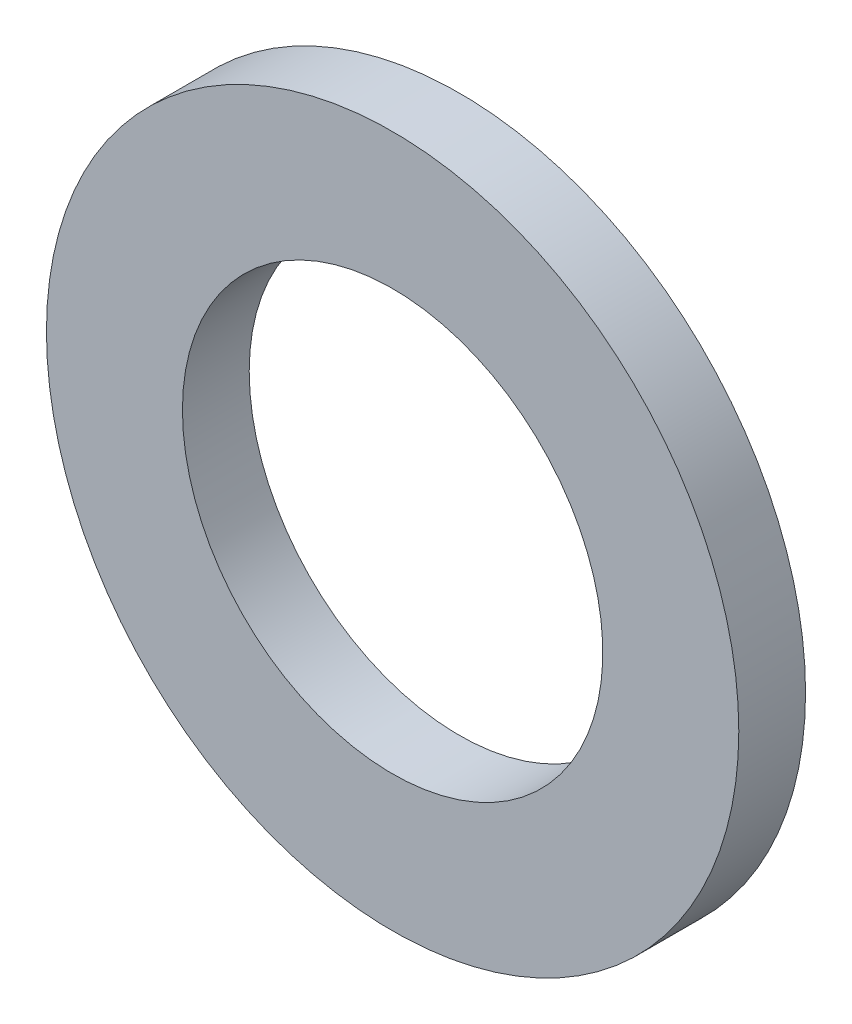
ISO-10303-21;
HEADER;
FILE_DESCRIPTION(('STEP AP214'),'2;1');
FILE_NAME('part.step','',(''),(''),'','','');
FILE_SCHEMA(('AUTOMOTIVE_DESIGN { 1 0 10303 214 1 1 1 1 }'));
ENDSEC;
DATA;
#1=APPLICATION_CONTEXT('core data for automotive mechanical design processes');
#2=APPLICATION_PROTOCOL_DEFINITION('international standard','automotive_design',2000,#1);
#3=PRODUCT_CONTEXT('',#1,'mechanical');
#4=PRODUCT('Part','Part','',(#3));
#5=PRODUCT_RELATED_PRODUCT_CATEGORY('part','',(#4));
#6=PRODUCT_DEFINITION_FORMATION('','',#4);
#7=PRODUCT_DEFINITION_CONTEXT('part definition',#1,'design');
#8=PRODUCT_DEFINITION('design','',#6,#7);
#9=PRODUCT_DEFINITION_SHAPE('','',#8);
#10=(LENGTH_UNIT() NAMED_UNIT(*) SI_UNIT(.MILLI.,.METRE.));
#11=(NAMED_UNIT(*) PLANE_ANGLE_UNIT() SI_UNIT($,.RADIAN.));
#12=(NAMED_UNIT(*) SI_UNIT($,.STERADIAN.) SOLID_ANGLE_UNIT());
#13=UNCERTAINTY_MEASURE_WITH_UNIT(LENGTH_MEASURE(1.E-05),#10,'distance_accuracy_value','');
#14=(GEOMETRIC_REPRESENTATION_CONTEXT(3) GLOBAL_UNCERTAINTY_ASSIGNED_CONTEXT((#13)) GLOBAL_UNIT_ASSIGNED_CONTEXT((#10,
#11,#12)) REPRESENTATION_CONTEXT('',''));
#15=CARTESIAN_POINT('',(0.,0.,0.));
#16=DIRECTION('',(0.,0.,1.));
#17=DIRECTION('',(1.,0.,0.));
#18=AXIS2_PLACEMENT_3D('',#15,#16,#17);
#19=CARTESIAN_POINT('',(0.,0.,2.7));
#20=DIRECTION('',(0.,0.,1.));
#21=DIRECTION('',(1.,0.,0.));
#22=AXIS2_PLACEMENT_3D('',#19,#20,#21);
#23=PLANE('',#22);
#24=CARTESIAN_POINT('',(0.,0.,2.7));
#25=DIRECTION('',(0.,0.,1.));
#26=DIRECTION('',(1.,0.,0.));
#27=AXIS2_PLACEMENT_3D('',#24,#25,#26);
#28=CIRCLE('',#27,14.);
#29=CARTESIAN_POINT('',(-14.,0.,2.7));
#30=VERTEX_POINT('',#29);
#31=EDGE_CURVE('E10',#30,#30,#28,.T.);
#32=ORIENTED_EDGE('',*,*,#31,.T.);
#33=EDGE_LOOP('',(#32));
#34=FACE_BOUND('',#33,.T.);
#35=CARTESIAN_POINT('',(0.,0.,2.7));
#36=DIRECTION('',(0.,0.,1.));
#37=DIRECTION('',(1.,0.,0.));
#38=AXIS2_PLACEMENT_3D('',#35,#36,#37);
#39=CIRCLE('',#38,8.5);
#40=CARTESIAN_POINT('',(-8.5,0.,2.7));
#41=VERTEX_POINT('',#40);
#42=EDGE_CURVE('E43',#41,#41,#39,.T.);
#43=ORIENTED_EDGE('',*,*,#42,.F.);
#44=EDGE_LOOP('',(#43));
#45=FACE_BOUND('',#44,.T.);
#46=ADVANCED_FACE('F32',(#34,#45),#23,.T.);
#47=CARTESIAN_POINT('',(0.,0.,0.));
#48=DIRECTION('',(0.,0.,1.));
#49=DIRECTION('',(1.,0.,0.));
#50=AXIS2_PLACEMENT_3D('',#47,#48,#49);
#51=PLANE('',#50);
#52=CARTESIAN_POINT('',(0.,0.,0.));
#53=DIRECTION('',(0.,0.,1.));
#54=DIRECTION('',(1.,0.,0.));
#55=AXIS2_PLACEMENT_3D('',#52,#53,#54);
#56=CIRCLE('',#55,14.);
#57=CARTESIAN_POINT('',(-14.,0.,0.));
#58=VERTEX_POINT('',#57);
#59=EDGE_CURVE('E36',#58,#58,#56,.T.);
#60=ORIENTED_EDGE('',*,*,#59,.F.);
#61=EDGE_LOOP('',(#60));
#62=FACE_BOUND('',#61,.T.);
#63=CARTESIAN_POINT('',(0.,0.,0.));
#64=DIRECTION('',(0.,0.,1.));
#65=DIRECTION('',(1.,0.,0.));
#66=AXIS2_PLACEMENT_3D('',#63,#64,#65);
#67=CIRCLE('',#66,8.5);
#68=CARTESIAN_POINT('',(-8.5,0.,0.));
#69=VERTEX_POINT('',#68);
#70=EDGE_CURVE('E45',#69,#69,#67,.T.);
#71=ORIENTED_EDGE('',*,*,#70,.T.);
#72=EDGE_LOOP('',(#71));
#73=FACE_BOUND('',#72,.T.);
#74=ADVANCED_FACE('F55',(#62,#73),#51,.F.);
#75=CARTESIAN_POINT('',(0.,0.,2.7));
#76=DIRECTION('',(0.,0.,-1.));
#77=DIRECTION('',(-1.,0.,0.));
#78=AXIS2_PLACEMENT_3D('',#75,#76,#77);
#79=CYLINDRICAL_SURFACE('',#78,14.);
#80=CARTESIAN_POINT('',(-14.,0.,2.7));
#81=CARTESIAN_POINT('',(-14.,0.,2.671875));
#82=CARTESIAN_POINT('',(-14.,0.,2.64375));
#83=CARTESIAN_POINT('',(-14.,0.,2.5875));
#84=CARTESIAN_POINT('',(-14.,0.,2.559375));
#85=CARTESIAN_POINT('',(-14.,0.,2.503125));
#86=CARTESIAN_POINT('',(-14.,0.,2.475));
#87=CARTESIAN_POINT('',(-14.,0.,2.41875));
#88=CARTESIAN_POINT('',(-14.,0.,2.390625));
#89=CARTESIAN_POINT('',(-14.,0.,2.334375));
#90=CARTESIAN_POINT('',(-14.,0.,2.30625));
#91=CARTESIAN_POINT('',(-14.,0.,2.25));
#92=CARTESIAN_POINT('',(-14.,0.,2.221875));
#93=CARTESIAN_POINT('',(-14.,0.,2.165625));
#94=CARTESIAN_POINT('',(-14.,0.,2.1375));
#95=CARTESIAN_POINT('',(-14.,0.,2.08125));
#96=CARTESIAN_POINT('',(-14.,0.,2.053125));
#97=CARTESIAN_POINT('',(-14.,0.,1.996875));
#98=CARTESIAN_POINT('',(-14.,0.,1.96875));
#99=CARTESIAN_POINT('',(-14.,0.,1.9125));
#100=CARTESIAN_POINT('',(-14.,0.,1.884375));
#101=CARTESIAN_POINT('',(-14.,0.,1.828125));
#102=CARTESIAN_POINT('',(-14.,0.,1.8));
#103=CARTESIAN_POINT('',(-14.,0.,1.74375));
#104=CARTESIAN_POINT('',(-14.,0.,1.715625));
#105=CARTESIAN_POINT('',(-14.,0.,1.659375));
#106=CARTESIAN_POINT('',(-14.,0.,1.63125));
#107=CARTESIAN_POINT('',(-14.,0.,1.575));
#108=CARTESIAN_POINT('',(-14.,0.,1.546875));
#109=CARTESIAN_POINT('',(-14.,0.,1.490625));
#110=CARTESIAN_POINT('',(-14.,0.,1.4625));
#111=CARTESIAN_POINT('',(-14.,0.,1.40625));
#112=CARTESIAN_POINT('',(-14.,0.,1.378125));
#113=CARTESIAN_POINT('',(-14.,0.,1.321875));
#114=CARTESIAN_POINT('',(-14.,0.,1.29375));
#115=CARTESIAN_POINT('',(-14.,0.,1.2375));
#116=CARTESIAN_POINT('',(-14.,0.,1.209375));
#117=CARTESIAN_POINT('',(-14.,0.,1.153125));
#118=CARTESIAN_POINT('',(-14.,0.,1.125));
#119=CARTESIAN_POINT('',(-14.,0.,1.06875));
#120=CARTESIAN_POINT('',(-14.,0.,1.040625));
#121=CARTESIAN_POINT('',(-14.,0.,0.984375));
#122=CARTESIAN_POINT('',(-14.,0.,0.95625));
#123=CARTESIAN_POINT('',(-14.,0.,0.9));
#124=CARTESIAN_POINT('',(-14.,0.,0.871875));
#125=CARTESIAN_POINT('',(-14.,0.,0.815625));
#126=CARTESIAN_POINT('',(-14.,0.,0.7875));
#127=CARTESIAN_POINT('',(-14.,0.,0.73125));
#128=CARTESIAN_POINT('',(-14.,0.,0.703125));
#129=CARTESIAN_POINT('',(-14.,0.,0.646875));
#130=CARTESIAN_POINT('',(-14.,0.,0.61875));
#131=CARTESIAN_POINT('',(-14.,0.,0.5625));
#132=CARTESIAN_POINT('',(-14.,0.,0.534375));
#133=CARTESIAN_POINT('',(-14.,0.,0.478125));
#134=CARTESIAN_POINT('',(-14.,0.,0.45));
#135=CARTESIAN_POINT('',(-14.,0.,0.39375));
#136=CARTESIAN_POINT('',(-14.,0.,0.365625));
#137=CARTESIAN_POINT('',(-14.,0.,0.309375));
#138=CARTESIAN_POINT('',(-14.,0.,0.28125));
#139=CARTESIAN_POINT('',(-14.,0.,0.225));
#140=CARTESIAN_POINT('',(-14.,0.,0.196875));
#141=CARTESIAN_POINT('',(-14.,0.,0.140625));
#142=CARTESIAN_POINT('',(-14.,0.,0.112499999999999));
#143=CARTESIAN_POINT('',(-14.,0.,0.0562499999999994));
#144=CARTESIAN_POINT('',(-14.,0.,0.0281249999999995));
#145=CARTESIAN_POINT('',(-14.,0.,0.));
#146=B_SPLINE_CURVE_WITH_KNOTS('',3,(#80,#81,#82,#83,#84,#85,#86,#87,#88,#89,#90,#91,#92,#93,
#94,#95,#96,#97,#98,#99,#100,#101,#102,#103,#104,#105,#106,#107,#108,#109,#110,#111,#112,#113,
#114,#115,#116,#117,#118,#119,#120,#121,#122,#123,#124,#125,#126,#127,#128,#129,#130,#131,#132,
#133,#134,#135,#136,#137,#138,#139,#140,#141,#142,#143,#144,#145),.UNSPECIFIED.,.F.,.F.,(4,2,2,
2,2,2,2,2,2,2,2,2,2,2,2,2,2,2,2,2,2,2,2,2,2,2,2,2,2,2,2,2,4),(0.,0.0843749999999998,0.16875,
0.253125,0.3375,0.421875,0.50625,0.590625,0.675,0.759375,0.84375,0.928125,1.0125,1.096875,
1.18125,1.265625,1.35,1.434375,1.51875,1.603125,1.6875,1.771875,1.85625,1.940625,2.025,2.109375,
2.19375,2.278125,2.3625,2.446875,2.53125,2.615625,2.7),.UNSPECIFIED.);
#147=EDGE_CURVE('BSEAM34',#30,#58,#146,.T.);
#148=ORIENTED_EDGE('',*,*,#31,.F.);
#149=ORIENTED_EDGE('',*,*,#59,.T.);
#150=ORIENTED_EDGE('',*,*,#147,.T.);
#151=ORIENTED_EDGE('',*,*,#147,.F.);
#152=EDGE_LOOP('',(#148,#150,#149,#151));
#153=FACE_BOUND('',#152,.T.);
#154=ADVANCED_FACE('F34',(#153),#79,.T.);
#155=CARTESIAN_POINT('',(0.,0.,2.7));
#156=DIRECTION('',(0.,0.,-1.));
#157=DIRECTION('',(-1.,0.,0.));
#158=AXIS2_PLACEMENT_3D('',#155,#156,#157);
#159=CYLINDRICAL_SURFACE('',#158,8.5);
#160=CARTESIAN_POINT('',(-8.5,0.,2.7));
#161=CARTESIAN_POINT('',(-8.5,0.,2.671875));
#162=CARTESIAN_POINT('',(-8.5,0.,2.64375));
#163=CARTESIAN_POINT('',(-8.5,0.,2.5875));
#164=CARTESIAN_POINT('',(-8.5,0.,2.559375));
#165=CARTESIAN_POINT('',(-8.5,0.,2.503125));
#166=CARTESIAN_POINT('',(-8.5,0.,2.475));
#167=CARTESIAN_POINT('',(-8.5,0.,2.41875));
#168=CARTESIAN_POINT('',(-8.5,0.,2.390625));
#169=CARTESIAN_POINT('',(-8.5,0.,2.334375));
#170=CARTESIAN_POINT('',(-8.5,0.,2.30625));
#171=CARTESIAN_POINT('',(-8.5,0.,2.25));
#172=CARTESIAN_POINT('',(-8.5,0.,2.221875));
#173=CARTESIAN_POINT('',(-8.5,0.,2.165625));
#174=CARTESIAN_POINT('',(-8.5,0.,2.1375));
#175=CARTESIAN_POINT('',(-8.5,0.,2.08125));
#176=CARTESIAN_POINT('',(-8.5,0.,2.053125));
#177=CARTESIAN_POINT('',(-8.5,0.,1.996875));
#178=CARTESIAN_POINT('',(-8.5,0.,1.96875));
#179=CARTESIAN_POINT('',(-8.5,0.,1.9125));
#180=CARTESIAN_POINT('',(-8.5,0.,1.884375));
#181=CARTESIAN_POINT('',(-8.5,0.,1.828125));
#182=CARTESIAN_POINT('',(-8.5,0.,1.8));
#183=CARTESIAN_POINT('',(-8.5,0.,1.74375));
#184=CARTESIAN_POINT('',(-8.5,0.,1.715625));
#185=CARTESIAN_POINT('',(-8.5,0.,1.659375));
#186=CARTESIAN_POINT('',(-8.5,0.,1.63125));
#187=CARTESIAN_POINT('',(-8.5,0.,1.575));
#188=CARTESIAN_POINT('',(-8.5,0.,1.546875));
#189=CARTESIAN_POINT('',(-8.5,0.,1.490625));
#190=CARTESIAN_POINT('',(-8.5,0.,1.4625));
#191=CARTESIAN_POINT('',(-8.5,0.,1.40625));
#192=CARTESIAN_POINT('',(-8.5,0.,1.378125));
#193=CARTESIAN_POINT('',(-8.5,0.,1.321875));
#194=CARTESIAN_POINT('',(-8.5,0.,1.29375));
#195=CARTESIAN_POINT('',(-8.5,0.,1.2375));
#196=CARTESIAN_POINT('',(-8.5,0.,1.209375));
#197=CARTESIAN_POINT('',(-8.5,0.,1.153125));
#198=CARTESIAN_POINT('',(-8.5,0.,1.125));
#199=CARTESIAN_POINT('',(-8.5,0.,1.06875));
#200=CARTESIAN_POINT('',(-8.5,0.,1.040625));
#201=CARTESIAN_POINT('',(-8.5,0.,0.984375));
#202=CARTESIAN_POINT('',(-8.5,0.,0.956249999999999));
#203=CARTESIAN_POINT('',(-8.5,0.,0.899999999999999));
#204=CARTESIAN_POINT('',(-8.5,0.,0.871875));
#205=CARTESIAN_POINT('',(-8.5,0.,0.815624999999999));
#206=CARTESIAN_POINT('',(-8.5,0.,0.787499999999999));
#207=CARTESIAN_POINT('',(-8.5,0.,0.73125));
#208=CARTESIAN_POINT('',(-8.5,0.,0.703125));
#209=CARTESIAN_POINT('',(-8.5,0.,0.646875));
#210=CARTESIAN_POINT('',(-8.5,0.,0.61875));
#211=CARTESIAN_POINT('',(-8.5,0.,0.5625));
#212=CARTESIAN_POINT('',(-8.5,0.,0.534375));
#213=CARTESIAN_POINT('',(-8.5,0.,0.478125));
#214=CARTESIAN_POINT('',(-8.5,0.,0.45));
#215=CARTESIAN_POINT('',(-8.5,0.,0.39375));
#216=CARTESIAN_POINT('',(-8.5,0.,0.365625));
#217=CARTESIAN_POINT('',(-8.5,0.,0.309375));
#218=CARTESIAN_POINT('',(-8.5,0.,0.28125));
#219=CARTESIAN_POINT('',(-8.5,0.,0.225));
#220=CARTESIAN_POINT('',(-8.5,0.,0.196875));
#221=CARTESIAN_POINT('',(-8.5,0.,0.140625));
#222=CARTESIAN_POINT('',(-8.5,0.,0.1125));
#223=CARTESIAN_POINT('',(-8.5,0.,0.0562499999999997));
#224=CARTESIAN_POINT('',(-8.5,0.,0.0281249999999996));
#225=CARTESIAN_POINT('',(-8.5,0.,0.));
#226=B_SPLINE_CURVE_WITH_KNOTS('',3,(#160,#161,#162,#163,#164,#165,#166,#167,#168,#169,#170,
#171,#172,#173,#174,#175,#176,#177,#178,#179,#180,#181,#182,#183,#184,#185,#186,#187,#188,#189,
#190,#191,#192,#193,#194,#195,#196,#197,#198,#199,#200,#201,#202,#203,#204,#205,#206,#207,#208,
#209,#210,#211,#212,#213,#214,#215,#216,#217,#218,#219,#220,#221,#222,#223,#224,#225),
.UNSPECIFIED.,.F.,.F.,(4,2,2,2,2,2,2,2,2,2,2,2,2,2,2,2,2,2,2,2,2,2,2,2,2,2,2,2,2,2,2,2,4),(0.,
0.0843750000000003,0.16875,0.253125,0.3375,0.421875,0.50625,0.590625,0.675,0.759375,0.84375,
0.928125000000001,1.0125,1.096875,1.18125,1.265625,1.35,1.434375,1.51875,1.603125,1.6875,
1.771875,1.85625,1.940625,2.025,2.109375,2.19375,2.278125,2.3625,2.446875,2.53125,2.615625,2.7),.UNSPECIFIED.);
#227=EDGE_CURVE('BSEAM51',#41,#69,#226,.T.);
#228=ORIENTED_EDGE('',*,*,#42,.T.);
#229=ORIENTED_EDGE('',*,*,#70,.F.);
#230=ORIENTED_EDGE('',*,*,#227,.T.);
#231=ORIENTED_EDGE('',*,*,#227,.F.);
#232=EDGE_LOOP('',(#228,#230,#229,#231));
#233=FACE_BOUND('',#232,.T.);
#234=ADVANCED_FACE('F51',(#233),#159,.F.);
#235=CLOSED_SHELL('',(#46,#74,#154,#234));
#236=MANIFOLD_SOLID_BREP('B2',#235);
#237=ADVANCED_BREP_SHAPE_REPRESENTATION('',(#18,#236),#14);
#238=SHAPE_DEFINITION_REPRESENTATION(#9,#237);
ENDSEC;
END-ISO-10303-21;
